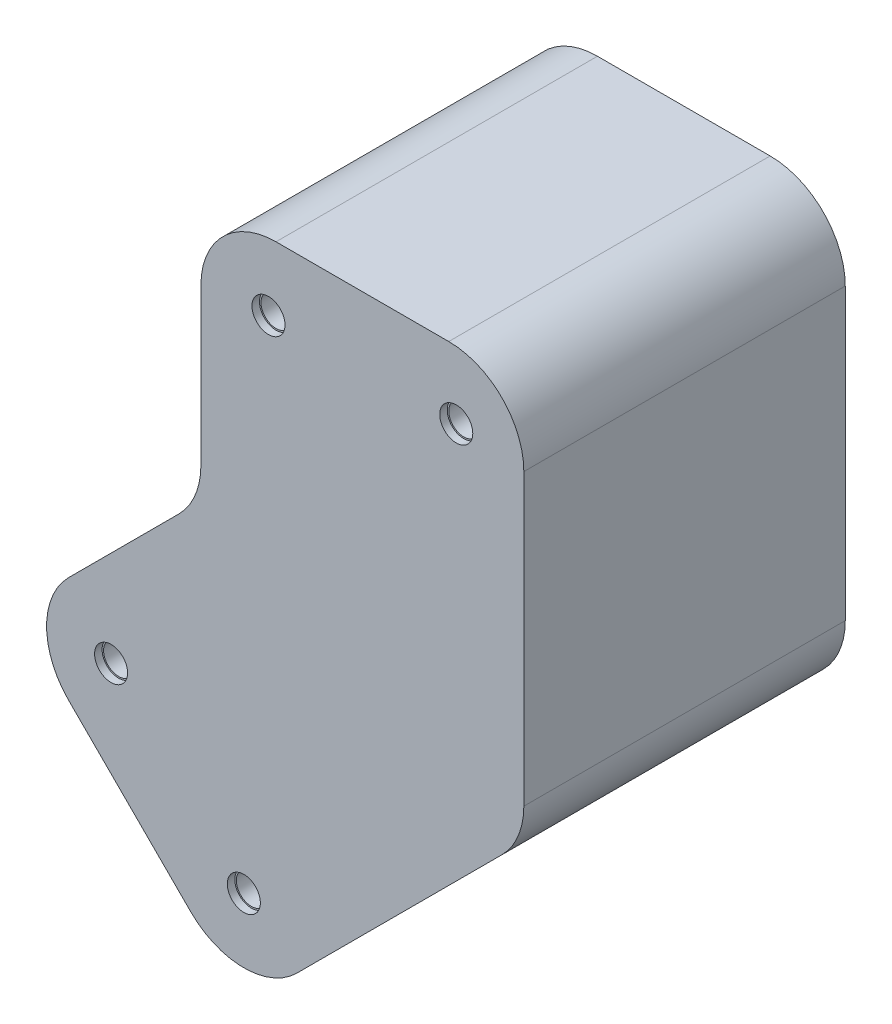
ISO-10303-21;
HEADER;
FILE_DESCRIPTION(('STEP AP214'),'2;1');
FILE_NAME('part.step','',(''),(''),'','','');
FILE_SCHEMA(('AUTOMOTIVE_DESIGN { 1 0 10303 214 1 1 1 1 }'));
ENDSEC;
DATA;
#1=APPLICATION_CONTEXT('core data for automotive mechanical design processes');
#2=APPLICATION_PROTOCOL_DEFINITION('international standard','automotive_design',2000,#1);
#3=PRODUCT_CONTEXT('',#1,'mechanical');
#4=PRODUCT('Part','Part','',(#3));
#5=PRODUCT_RELATED_PRODUCT_CATEGORY('part','',(#4));
#6=PRODUCT_DEFINITION_FORMATION('','',#4);
#7=PRODUCT_DEFINITION_CONTEXT('part definition',#1,'design');
#8=PRODUCT_DEFINITION('design','',#6,#7);
#9=PRODUCT_DEFINITION_SHAPE('','',#8);
#10=(LENGTH_UNIT() NAMED_UNIT(*) SI_UNIT(.MILLI.,.METRE.));
#11=(NAMED_UNIT(*) PLANE_ANGLE_UNIT() SI_UNIT($,.RADIAN.));
#12=(NAMED_UNIT(*) SI_UNIT($,.STERADIAN.) SOLID_ANGLE_UNIT());
#13=UNCERTAINTY_MEASURE_WITH_UNIT(LENGTH_MEASURE(1.E-05),#10,'distance_accuracy_value','');
#14=(GEOMETRIC_REPRESENTATION_CONTEXT(3) GLOBAL_UNCERTAINTY_ASSIGNED_CONTEXT((#13)) GLOBAL_UNIT_ASSIGNED_CONTEXT((#10,
#11,#12)) REPRESENTATION_CONTEXT('',''));
#15=CARTESIAN_POINT('',(0.,0.,0.));
#16=DIRECTION('',(0.,0.,1.));
#17=DIRECTION('',(1.,0.,0.));
#18=AXIS2_PLACEMENT_3D('',#15,#16,#17);
#19=CARTESIAN_POINT('',(95.4949493661166,117.817279836453,42.8));
#20=DIRECTION('',(0.,-1.,0.));
#21=DIRECTION('',(0.,0.,-1.));
#22=AXIS2_PLACEMENT_3D('',#19,#20,#21);
#23=PLANE('',#22);
#24=DIRECTION('',(-1.,0.,0.));
#25=VECTOR('',#24,1.);
#26=CARTESIAN_POINT('',(95.4949493661166,117.817279836453,42.8));
#27=LINE('',#26,#25);
#28=CARTESIAN_POINT('',(85.4949493661166,117.817279836453,42.8));
#29=VERTEX_POINT('',#28);
#30=CARTESIAN_POINT('',(62.4949493661166,117.817279836453,42.8));
#31=VERTEX_POINT('',#30);
#32=EDGE_CURVE('E253',#29,#31,#27,.T.);
#33=ORIENTED_EDGE('',*,*,#32,.F.);
#34=DIRECTION('',(0.,0.,-1.));
#35=VECTOR('',#34,1.);
#36=CARTESIAN_POINT('',(85.4949493661166,117.817279836453,42.8));
#37=LINE('',#36,#35);
#38=CARTESIAN_POINT('',(85.4949493661166,117.817279836453,0.));
#39=VERTEX_POINT('',#38);
#40=EDGE_CURVE('E320',#29,#39,#37,.T.);
#41=ORIENTED_EDGE('',*,*,#40,.T.);
#42=DIRECTION('',(-1.,0.,0.));
#43=VECTOR('',#42,1.);
#44=CARTESIAN_POINT('',(95.4949493661166,117.817279836453,0.));
#45=LINE('',#44,#43);
#46=CARTESIAN_POINT('',(62.4949493661166,117.817279836453,0.));
#47=VERTEX_POINT('',#46);
#48=EDGE_CURVE('E252',#39,#47,#45,.T.);
#49=ORIENTED_EDGE('',*,*,#48,.T.);
#50=DIRECTION('',(0.,0.,-1.));
#51=VECTOR('',#50,1.);
#52=CARTESIAN_POINT('',(62.4949493661166,117.817279836453,42.8));
#53=LINE('',#52,#51);
#54=EDGE_CURVE('E318',#47,#31,#53,.F.);
#55=ORIENTED_EDGE('',*,*,#54,.T.);
#56=EDGE_LOOP('',(#33,#41,#49,#55));
#57=FACE_BOUND('',#56,.T.);
#58=ADVANCED_FACE('F39',(#57),#23,.F.);
#59=CARTESIAN_POINT('',(52.4949493661166,117.817279836453,42.8));
#60=DIRECTION('',(1.,0.,0.));
#61=DIRECTION('',(0.,0.,-1.));
#62=AXIS2_PLACEMENT_3D('',#59,#60,#61);
#63=PLANE('',#62);
#64=DIRECTION('',(0.,-1.,0.));
#65=VECTOR('',#64,1.);
#66=CARTESIAN_POINT('',(52.4949493661166,117.817279836453,42.8));
#67=LINE('',#66,#65);
#68=CARTESIAN_POINT('',(52.4949493661166,107.817279836453,42.8));
#69=VERTEX_POINT('',#68);
#70=CARTESIAN_POINT('',(52.4949493661166,87.042676580869,42.8));
#71=VERTEX_POINT('',#70);
#72=EDGE_CURVE('E256',#69,#71,#67,.T.);
#73=ORIENTED_EDGE('',*,*,#72,.F.);
#74=DIRECTION('',(0.,0.,-1.));
#75=VECTOR('',#74,1.);
#76=CARTESIAN_POINT('',(52.4949493661166,107.817279836453,42.8));
#77=LINE('',#76,#75);
#78=CARTESIAN_POINT('',(52.4949493661166,107.817279836453,0.));
#79=VERTEX_POINT('',#78);
#80=EDGE_CURVE('E325',#69,#79,#77,.T.);
#81=ORIENTED_EDGE('',*,*,#80,.T.);
#82=DIRECTION('',(0.,-1.,0.));
#83=VECTOR('',#82,1.);
#84=CARTESIAN_POINT('',(52.4949493661166,117.817279836453,0.));
#85=LINE('',#84,#83);
#86=CARTESIAN_POINT('',(52.4949493661166,87.042676580869,0.));
#87=VERTEX_POINT('',#86);
#88=EDGE_CURVE('E273',#79,#87,#85,.T.);
#89=ORIENTED_EDGE('',*,*,#88,.T.);
#90=DIRECTION('',(0.,0.,-1.));
#91=VECTOR('',#90,1.);
#92=CARTESIAN_POINT('',(52.4949493661166,87.042676580869,42.8));
#93=LINE('',#92,#91);
#94=EDGE_CURVE('E323',#87,#71,#93,.F.);
#95=ORIENTED_EDGE('',*,*,#94,.T.);
#96=EDGE_LOOP('',(#73,#81,#89,#95));
#97=FACE_BOUND('',#96,.T.);
#98=ADVANCED_FACE('F342',(#97),#63,.F.);
#99=CARTESIAN_POINT('',(52.4949493661166,82.9005409571381,42.8));
#100=DIRECTION('',(0.707106781186547,-0.707106781186548,0.));
#101=DIRECTION('',(0.707106781186548,0.707106781186547,0.));
#102=AXIS2_PLACEMENT_3D('',#99,#100,#101);
#103=PLANE('',#102);
#104=DIRECTION('',(-0.707106781186548,-0.707106781186547,0.));
#105=VECTOR('',#104,1.);
#106=CARTESIAN_POINT('',(52.4949493661166,82.9005409571381,42.8));
#107=LINE('',#106,#105);
#108=CARTESIAN_POINT('',(49.5660171779821,79.9716087690036,42.8));
#109=VERTEX_POINT('',#108);
#110=CARTESIAN_POINT('',(34.8761543394987,65.2817459305201,42.8));
#111=VERTEX_POINT('',#110);
#112=EDGE_CURVE('E260',#109,#111,#107,.T.);
#113=ORIENTED_EDGE('',*,*,#112,.F.);
#114=DIRECTION('',(0.,0.,-1.));
#115=VECTOR('',#114,1.);
#116=CARTESIAN_POINT('',(49.5660171779821,79.9716087690036,0.));
#117=LINE('',#116,#115);
#118=CARTESIAN_POINT('',(49.5660171779821,79.9716087690036,0.));
#119=VERTEX_POINT('',#118);
#120=EDGE_CURVE('E330',#109,#119,#117,.T.);
#121=ORIENTED_EDGE('',*,*,#120,.T.);
#122=DIRECTION('',(-0.707106781186548,-0.707106781186547,0.));
#123=VECTOR('',#122,1.);
#124=CARTESIAN_POINT('',(52.4949493661166,82.9005409571381,0.));
#125=LINE('',#124,#123);
#126=CARTESIAN_POINT('',(34.8761543394987,65.2817459305201,0.));
#127=VERTEX_POINT('',#126);
#128=EDGE_CURVE('E276',#119,#127,#125,.T.);
#129=ORIENTED_EDGE('',*,*,#128,.T.);
#130=DIRECTION('',(0.,0.,-1.));
#131=VECTOR('',#130,1.);
#132=CARTESIAN_POINT('',(34.8761543394987,65.2817459305201,42.8));
#133=LINE('',#132,#131);
#134=EDGE_CURVE('E328',#127,#111,#133,.F.);
#135=ORIENTED_EDGE('',*,*,#134,.T.);
#136=EDGE_LOOP('',(#113,#121,#129,#135));
#137=FACE_BOUND('',#136,.T.);
#138=ADVANCED_FACE('F350',(#137),#103,.F.);
#139=CARTESIAN_POINT('',(27.8050865276332,58.2106781186546,42.8));
#140=DIRECTION('',(0.707106781186548,0.707106781186548,0.));
#141=DIRECTION('',(-0.707106781186548,0.707106781186548,0.));
#142=AXIS2_PLACEMENT_3D('',#139,#140,#141);
#143=PLANE('',#142);
#144=DIRECTION('',(0.707106781186548,-0.707106781186548,0.));
#145=VECTOR('',#144,1.);
#146=CARTESIAN_POINT('',(27.8050865276332,58.2106781186546,0.));
#147=LINE('',#146,#145);
#148=CARTESIAN_POINT('',(34.8761543394987,51.1396103067891,0.));
#149=VERTEX_POINT('',#148);
#150=CARTESIAN_POINT('',(51.1396103067892,34.8761543394986,0.));
#151=VERTEX_POINT('',#150);
#152=EDGE_CURVE('E279',#149,#151,#147,.T.);
#153=ORIENTED_EDGE('',*,*,#152,.T.);
#154=DIRECTION('',(0.,0.,-1.));
#155=VECTOR('',#154,1.);
#156=CARTESIAN_POINT('',(51.1396103067892,34.8761543394986,42.8));
#157=LINE('',#156,#155);
#158=CARTESIAN_POINT('',(51.1396103067892,34.8761543394986,42.8));
#159=VERTEX_POINT('',#158);
#160=EDGE_CURVE('E303',#151,#159,#157,.F.);
#161=ORIENTED_EDGE('',*,*,#160,.T.);
#162=DIRECTION('',(0.707106781186548,-0.707106781186548,0.));
#163=VECTOR('',#162,1.);
#164=CARTESIAN_POINT('',(27.8050865276332,58.2106781186546,42.8));
#165=LINE('',#164,#163);
#166=CARTESIAN_POINT('',(34.8761543394987,51.1396103067891,42.8));
#167=VERTEX_POINT('',#166);
#168=EDGE_CURVE('E263',#167,#159,#165,.T.);
#169=ORIENTED_EDGE('',*,*,#168,.F.);
#170=DIRECTION('',(0.,0.,-1.));
#171=VECTOR('',#170,1.);
#172=CARTESIAN_POINT('',(34.8761543394987,51.1396103067891,42.8));
#173=LINE('',#172,#171);
#174=EDGE_CURVE('E300',#167,#149,#173,.T.);
#175=ORIENTED_EDGE('',*,*,#174,.T.);
#176=EDGE_LOOP('',(#153,#161,#169,#175));
#177=FACE_BOUND('',#176,.T.);
#178=ADVANCED_FACE('F357',(#177),#143,.F.);
#179=CARTESIAN_POINT('',(58.2106781186547,27.8050865276331,42.8));
#180=DIRECTION('',(-0.707106781186548,0.707106781186547,0.));
#181=DIRECTION('',(-0.707106781186547,-0.707106781186548,0.));
#182=AXIS2_PLACEMENT_3D('',#179,#180,#181);
#183=PLANE('',#182);
#184=DIRECTION('',(0.707106781186547,0.707106781186548,0.));
#185=VECTOR('',#184,1.);
#186=CARTESIAN_POINT('',(58.2106781186547,27.8050865276331,42.8));
#187=LINE('',#186,#185);
#188=CARTESIAN_POINT('',(65.2817459305202,34.8761543394986,42.8));
#189=VERTEX_POINT('',#188);
#190=CARTESIAN_POINT('',(92.5660171779821,62.1604255869605,42.8));
#191=VERTEX_POINT('',#190);
#192=EDGE_CURVE('E266',#189,#191,#187,.T.);
#193=ORIENTED_EDGE('',*,*,#192,.F.);
#194=DIRECTION('',(0.,0.,-1.));
#195=VECTOR('',#194,1.);
#196=CARTESIAN_POINT('',(65.2817459305202,34.8761543394986,42.8));
#197=LINE('',#196,#195);
#198=CARTESIAN_POINT('',(65.2817459305202,34.8761543394986,0.));
#199=VERTEX_POINT('',#198);
#200=EDGE_CURVE('E287',#189,#199,#197,.T.);
#201=ORIENTED_EDGE('',*,*,#200,.T.);
#202=DIRECTION('',(0.707106781186547,0.707106781186548,0.));
#203=VECTOR('',#202,1.);
#204=CARTESIAN_POINT('',(58.2106781186547,27.8050865276331,0.));
#205=LINE('',#204,#203);
#206=CARTESIAN_POINT('',(92.5660171779821,62.1604255869605,0.));
#207=VERTEX_POINT('',#206);
#208=EDGE_CURVE('E282',#199,#207,#205,.T.);
#209=ORIENTED_EDGE('',*,*,#208,.T.);
#210=DIRECTION('',(0.,0.,-1.));
#211=VECTOR('',#210,1.);
#212=CARTESIAN_POINT('',(92.5660171779821,62.1604255869605,42.8));
#213=LINE('',#212,#211);
#214=EDGE_CURVE('E270',#207,#191,#213,.F.);
#215=ORIENTED_EDGE('',*,*,#214,.T.);
#216=EDGE_LOOP('',(#193,#201,#209,#215));
#217=FACE_BOUND('',#216,.T.);
#218=ADVANCED_FACE('F365',(#217),#183,.F.);
#219=CARTESIAN_POINT('',(95.4949493661166,65.089357775095,42.8));
#220=DIRECTION('',(-1.,0.,0.));
#221=DIRECTION('',(0.,0.,1.));
#222=AXIS2_PLACEMENT_3D('',#219,#220,#221);
#223=PLANE('',#222);
#224=DIRECTION('',(0.,1.,0.));
#225=VECTOR('',#224,1.);
#226=CARTESIAN_POINT('',(95.4949493661166,65.089357775095,42.8));
#227=LINE('',#226,#225);
#228=CARTESIAN_POINT('',(95.4949493661166,69.231493398826,42.8));
#229=VERTEX_POINT('',#228);
#230=CARTESIAN_POINT('',(95.4949493661166,107.817279836453,42.8));
#231=VERTEX_POINT('',#230);
#232=EDGE_CURVE('E268',#229,#231,#227,.T.);
#233=ORIENTED_EDGE('',*,*,#232,.F.);
#234=DIRECTION('',(0.,0.,-1.));
#235=VECTOR('',#234,1.);
#236=CARTESIAN_POINT('',(95.4949493661166,69.231493398826,42.8));
#237=LINE('',#236,#235);
#238=CARTESIAN_POINT('',(95.4949493661166,69.231493398826,0.));
#239=VERTEX_POINT('',#238);
#240=EDGE_CURVE('E315',#229,#239,#237,.T.);
#241=ORIENTED_EDGE('',*,*,#240,.T.);
#242=DIRECTION('',(0.,1.,0.));
#243=VECTOR('',#242,1.);
#244=CARTESIAN_POINT('',(95.4949493661166,65.089357775095,0.));
#245=LINE('',#244,#243);
#246=CARTESIAN_POINT('',(95.4949493661166,107.817279836453,0.));
#247=VERTEX_POINT('',#246);
#248=EDGE_CURVE('E257',#239,#247,#245,.T.);
#249=ORIENTED_EDGE('',*,*,#248,.T.);
#250=DIRECTION('',(0.,0.,-1.));
#251=VECTOR('',#250,1.);
#252=CARTESIAN_POINT('',(95.4949493661166,107.817279836453,42.8));
#253=LINE('',#252,#251);
#254=EDGE_CURVE('E54',#247,#231,#253,.F.);
#255=ORIENTED_EDGE('',*,*,#254,.T.);
#256=EDGE_LOOP('',(#233,#241,#249,#255));
#257=FACE_BOUND('',#256,.T.);
#258=ADVANCED_FACE('F371',(#257),#223,.F.);
#259=CARTESIAN_POINT('',(0.,0.,42.8));
#260=DIRECTION('',(0.,0.,1.));
#261=DIRECTION('',(1.,0.,0.));
#262=AXIS2_PLACEMENT_3D('',#259,#260,#261);
#263=PLANE('',#262);
#264=CARTESIAN_POINT('',(61.4949493661166,108.817279836453,42.8));
#265=DIRECTION('',(0.,0.,1.));
#266=DIRECTION('',(1.,0.,0.));
#267=AXIS2_PLACEMENT_3D('',#264,#265,#266);
#268=CIRCLE('',#267,2.2);
#269=CARTESIAN_POINT('',(63.6949493661166,108.817279836453,42.8));
#270=VERTEX_POINT('',#269);
#271=EDGE_CURVE('E779',#270,#270,#268,.T.);
#272=ORIENTED_EDGE('',*,*,#271,.F.);
#273=EDGE_LOOP('',(#272));
#274=FACE_BOUND('',#273,.T.);
#275=CARTESIAN_POINT('',(86.4949493661166,108.817279836453,42.8));
#276=DIRECTION('',(0.,0.,1.));
#277=DIRECTION('',(1.,0.,0.));
#278=AXIS2_PLACEMENT_3D('',#275,#276,#277);
#279=CIRCLE('',#278,2.19999999999999);
#280=CARTESIAN_POINT('',(88.6949493661166,108.817279836453,42.8));
#281=VERTEX_POINT('',#280);
#282=EDGE_CURVE('E161',#281,#281,#279,.T.);
#283=ORIENTED_EDGE('',*,*,#282,.F.);
#284=EDGE_LOOP('',(#283));
#285=FACE_BOUND('',#284,.T.);
#286=CARTESIAN_POINT('',(58.2106781186547,40.5330085889909,42.8));
#287=DIRECTION('',(0.,0.,1.));
#288=DIRECTION('',(1.,0.,0.));
#289=AXIS2_PLACEMENT_3D('',#286,#287,#288);
#290=CIRCLE('',#289,2.19999999999999);
#291=CARTESIAN_POINT('',(60.4106781186547,40.5330085889909,42.8));
#292=VERTEX_POINT('',#291);
#293=EDGE_CURVE('E180',#292,#292,#290,.T.);
#294=ORIENTED_EDGE('',*,*,#293,.F.);
#295=EDGE_LOOP('',(#294));
#296=FACE_BOUND('',#295,.T.);
#297=CARTESIAN_POINT('',(40.533008588991,58.2106781186546,42.8));
#298=DIRECTION('',(0.,0.,1.));
#299=DIRECTION('',(1.,0.,0.));
#300=AXIS2_PLACEMENT_3D('',#297,#298,#299);
#301=CIRCLE('',#300,2.19999999999999);
#302=CARTESIAN_POINT('',(42.733008588991,58.2106781186546,42.8));
#303=VERTEX_POINT('',#302);
#304=EDGE_CURVE('E192',#303,#303,#301,.T.);
#305=ORIENTED_EDGE('',*,*,#304,.F.);
#306=EDGE_LOOP('',(#305));
#307=FACE_BOUND('',#306,.T.);
#308=ORIENTED_EDGE('',*,*,#168,.T.);
#309=CARTESIAN_POINT('',(58.2106781186547,41.947222151364,42.8));
#310=DIRECTION('',(0.,0.,1.));
#311=DIRECTION('',(1.,0.,0.));
#312=AXIS2_PLACEMENT_3D('',#309,#310,#311);
#313=CIRCLE('',#312,10.);
#314=EDGE_CURVE('E312',#159,#189,#313,.T.);
#315=ORIENTED_EDGE('',*,*,#314,.T.);
#316=ORIENTED_EDGE('',*,*,#192,.T.);
#317=CARTESIAN_POINT('',(85.4949493661166,69.231493398826,42.8));
#318=DIRECTION('',(0.,0.,1.));
#319=DIRECTION('',(1.,0.,0.));
#320=AXIS2_PLACEMENT_3D('',#317,#318,#319);
#321=CIRCLE('',#320,10.);
#322=EDGE_CURVE('E61',#191,#229,#321,.T.);
#323=ORIENTED_EDGE('',*,*,#322,.T.);
#324=ORIENTED_EDGE('',*,*,#232,.T.);
#325=CARTESIAN_POINT('',(85.4949493661166,107.817279836453,42.8));
#326=DIRECTION('',(0.,0.,1.));
#327=DIRECTION('',(1.,0.,0.));
#328=AXIS2_PLACEMENT_3D('',#325,#326,#327);
#329=CIRCLE('',#328,10.);
#330=EDGE_CURVE('E309',#231,#29,#329,.T.);
#331=ORIENTED_EDGE('',*,*,#330,.T.);
#332=ORIENTED_EDGE('',*,*,#32,.T.);
#333=CARTESIAN_POINT('',(62.4949493661166,107.817279836453,42.8));
#334=DIRECTION('',(0.,0.,1.));
#335=DIRECTION('',(1.,0.,0.));
#336=AXIS2_PLACEMENT_3D('',#333,#334,#335);
#337=CIRCLE('',#336,10.);
#338=EDGE_CURVE('E307',#31,#69,#337,.T.);
#339=ORIENTED_EDGE('',*,*,#338,.T.);
#340=ORIENTED_EDGE('',*,*,#72,.T.);
#341=CARTESIAN_POINT('',(42.4949493661166,87.042676580869,42.8));
#342=DIRECTION('',(0.,0.,1.));
#343=DIRECTION('',(1.,0.,0.));
#344=AXIS2_PLACEMENT_3D('',#341,#342,#343);
#345=CIRCLE('',#344,10.);
#346=EDGE_CURVE('E11',#71,#109,#345,.F.);
#347=ORIENTED_EDGE('',*,*,#346,.T.);
#348=ORIENTED_EDGE('',*,*,#112,.T.);
#349=CARTESIAN_POINT('',(41.9472221513641,58.2106781186546,42.8));
#350=DIRECTION('',(0.,0.,1.));
#351=DIRECTION('',(1.,0.,0.));
#352=AXIS2_PLACEMENT_3D('',#349,#350,#351);
#353=CIRCLE('',#352,10.);
#354=EDGE_CURVE('E305',#111,#167,#353,.T.);
#355=ORIENTED_EDGE('',*,*,#354,.T.);
#356=EDGE_LOOP('',(#308,#315,#316,#323,#324,#331,#332,#339,#340,#347,#348,#355));
#357=FACE_BOUND('',#356,.T.);
#358=ADVANCED_FACE('F347',(#274,#285,#296,#307,#357),#263,.T.);
#359=CARTESIAN_POINT('',(0.,0.,0.));
#360=DIRECTION('',(0.,0.,1.));
#361=DIRECTION('',(1.,0.,0.));
#362=AXIS2_PLACEMENT_3D('',#359,#360,#361);
#363=PLANE('',#362);
#364=CARTESIAN_POINT('',(86.4949493661166,108.817279836453,0.));
#365=DIRECTION('',(0.,0.,-1.));
#366=DIRECTION('',(-1.,0.,0.));
#367=AXIS2_PLACEMENT_3D('',#364,#365,#366);
#368=CIRCLE('',#367,2.19999999999999);
#369=CARTESIAN_POINT('',(84.2949493661166,108.817279836453,0.));
#370=VERTEX_POINT('',#369);
#371=EDGE_CURVE('E204',#370,#370,#368,.T.);
#372=ORIENTED_EDGE('',*,*,#371,.F.);
#373=EDGE_LOOP('',(#372));
#374=FACE_BOUND('',#373,.T.);
#375=CARTESIAN_POINT('',(61.4949493661166,108.817279836453,0.));
#376=DIRECTION('',(0.,0.,-1.));
#377=DIRECTION('',(-1.,0.,0.));
#378=AXIS2_PLACEMENT_3D('',#375,#376,#377);
#379=CIRCLE('',#378,2.2);
#380=CARTESIAN_POINT('',(59.2949493661166,108.817279836453,0.));
#381=VERTEX_POINT('',#380);
#382=EDGE_CURVE('E216',#381,#381,#379,.T.);
#383=ORIENTED_EDGE('',*,*,#382,.F.);
#384=EDGE_LOOP('',(#383));
#385=FACE_BOUND('',#384,.T.);
#386=CARTESIAN_POINT('',(58.2106781186547,40.5330085889909,0.));
#387=DIRECTION('',(0.,0.,-1.));
#388=DIRECTION('',(-1.,0.,0.));
#389=AXIS2_PLACEMENT_3D('',#386,#387,#388);
#390=CIRCLE('',#389,2.2);
#391=CARTESIAN_POINT('',(56.0106781186547,40.5330085889909,0.));
#392=VERTEX_POINT('',#391);
#393=EDGE_CURVE('E228',#392,#392,#390,.T.);
#394=ORIENTED_EDGE('',*,*,#393,.F.);
#395=EDGE_LOOP('',(#394));
#396=FACE_BOUND('',#395,.T.);
#397=CARTESIAN_POINT('',(40.533008588991,58.2106781186546,0.));
#398=DIRECTION('',(0.,0.,-1.));
#399=DIRECTION('',(-1.,0.,0.));
#400=AXIS2_PLACEMENT_3D('',#397,#398,#399);
#401=CIRCLE('',#400,2.2);
#402=CARTESIAN_POINT('',(38.333008588991,58.2106781186546,0.));
#403=VERTEX_POINT('',#402);
#404=EDGE_CURVE('E240',#403,#403,#401,.T.);
#405=ORIENTED_EDGE('',*,*,#404,.F.);
#406=EDGE_LOOP('',(#405));
#407=FACE_BOUND('',#406,.T.);
#408=ORIENTED_EDGE('',*,*,#208,.F.);
#409=CARTESIAN_POINT('',(58.2106781186547,41.947222151364,0.));
#410=DIRECTION('',(0.,0.,1.));
#411=DIRECTION('',(1.,0.,0.));
#412=AXIS2_PLACEMENT_3D('',#409,#410,#411);
#413=CIRCLE('',#412,10.);
#414=EDGE_CURVE('E298',#199,#151,#413,.F.);
#415=ORIENTED_EDGE('',*,*,#414,.T.);
#416=ORIENTED_EDGE('',*,*,#152,.F.);
#417=CARTESIAN_POINT('',(41.9472221513641,58.2106781186546,0.));
#418=DIRECTION('',(0.,0.,1.));
#419=DIRECTION('',(1.,0.,0.));
#420=AXIS2_PLACEMENT_3D('',#417,#418,#419);
#421=CIRCLE('',#420,10.);
#422=EDGE_CURVE('E290',#149,#127,#421,.F.);
#423=ORIENTED_EDGE('',*,*,#422,.T.);
#424=ORIENTED_EDGE('',*,*,#128,.F.);
#425=CARTESIAN_POINT('',(42.4949493661166,87.042676580869,0.));
#426=DIRECTION('',(0.,0.,1.));
#427=DIRECTION('',(1.,0.,0.));
#428=AXIS2_PLACEMENT_3D('',#425,#426,#427);
#429=CIRCLE('',#428,10.);
#430=EDGE_CURVE('E47',#119,#87,#429,.T.);
#431=ORIENTED_EDGE('',*,*,#430,.T.);
#432=ORIENTED_EDGE('',*,*,#88,.F.);
#433=CARTESIAN_POINT('',(62.4949493661166,107.817279836453,0.));
#434=DIRECTION('',(0.,0.,1.));
#435=DIRECTION('',(1.,0.,0.));
#436=AXIS2_PLACEMENT_3D('',#433,#434,#435);
#437=CIRCLE('',#436,10.);
#438=EDGE_CURVE('E292',#79,#47,#437,.F.);
#439=ORIENTED_EDGE('',*,*,#438,.T.);
#440=ORIENTED_EDGE('',*,*,#48,.F.);
#441=CARTESIAN_POINT('',(85.4949493661166,107.817279836453,0.));
#442=DIRECTION('',(0.,0.,1.));
#443=DIRECTION('',(1.,0.,0.));
#444=AXIS2_PLACEMENT_3D('',#441,#442,#443);
#445=CIRCLE('',#444,10.);
#446=EDGE_CURVE('E294',#39,#247,#445,.F.);
#447=ORIENTED_EDGE('',*,*,#446,.T.);
#448=ORIENTED_EDGE('',*,*,#248,.F.);
#449=CARTESIAN_POINT('',(85.4949493661166,69.231493398826,0.));
#450=DIRECTION('',(0.,0.,1.));
#451=DIRECTION('',(1.,0.,0.));
#452=AXIS2_PLACEMENT_3D('',#449,#450,#451);
#453=CIRCLE('',#452,10.);
#454=EDGE_CURVE('E296',#239,#207,#453,.F.);
#455=ORIENTED_EDGE('',*,*,#454,.T.);
#456=EDGE_LOOP('',(#408,#415,#416,#423,#424,#431,#432,#439,#440,#447,#448,#455));
#457=FACE_BOUND('',#456,.T.);
#458=ADVANCED_FACE('F336',(#374,#385,#396,#407,#457),#363,.F.);
#459=CARTESIAN_POINT('',(40.533008588991,58.2106781186546,5.49999999999999));
#460=DIRECTION('',(0.,0.,-1.));
#461=DIRECTION('',(-1.,0.,0.));
#462=AXIS2_PLACEMENT_3D('',#459,#460,#461);
#463=CONICAL_SURFACE('',#462,1.99999999999999,1.02974425867665);
#464=CARTESIAN_POINT('',(40.533008588991,58.2106781186546,6.70172123805512));
#465=VERTEX_POINT('',#464);
#466=VERTEX_LOOP('',#465);
#467=FACE_BOUND('',#466,.T.);
#468=CARTESIAN_POINT('',(40.533008588991,58.2106781186546,5.49999999999999));
#469=DIRECTION('',(0.,0.,-1.));
#470=DIRECTION('',(-1.,0.,0.));
#471=AXIS2_PLACEMENT_3D('',#468,#469,#470);
#472=CIRCLE('',#471,1.99999999999999);
#473=CARTESIAN_POINT('',(38.533008588991,58.2106781186546,5.49999999999999));
#474=VERTEX_POINT('',#473);
#475=EDGE_CURVE('E249',#474,#474,#472,.T.);
#476=ORIENTED_EDGE('',*,*,#475,.T.);
#477=EDGE_LOOP('',(#476));
#478=FACE_BOUND('',#477,.T.);
#479=ADVANCED_FACE('F706',(#467,#478),#463,.F.);
#480=CARTESIAN_POINT('',(40.533008588991,58.2106781186546,0.));
#481=DIRECTION('',(0.,0.,-1.));
#482=DIRECTION('',(-1.,0.,0.));
#483=AXIS2_PLACEMENT_3D('',#480,#481,#482);
#484=CYLINDRICAL_SURFACE('',#483,2.);
#485=ORIENTED_EDGE('',*,*,#475,.F.);
#486=EDGE_LOOP('',(#485));
#487=FACE_BOUND('',#486,.T.);
#488=CARTESIAN_POINT('',(40.533008588991,58.2106781186546,1.));
#489=DIRECTION('',(0.,0.,-1.));
#490=DIRECTION('',(-1.,0.,0.));
#491=AXIS2_PLACEMENT_3D('',#488,#489,#490);
#492=CIRCLE('',#491,2.);
#493=CARTESIAN_POINT('',(38.533008588991,58.2106781186546,1.));
#494=VERTEX_POINT('',#493);
#495=EDGE_CURVE('E246',#494,#494,#492,.T.);
#496=ORIENTED_EDGE('',*,*,#495,.T.);
#497=EDGE_LOOP('',(#496));
#498=FACE_BOUND('',#497,.T.);
#499=ADVANCED_FACE('F697',(#487,#498),#484,.F.);
#500=CARTESIAN_POINT('',(42.533008588991,58.2106781186546,1.));
#501=DIRECTION('',(0.,0.,1.));
#502=DIRECTION('',(1.,0.,0.));
#503=AXIS2_PLACEMENT_3D('',#500,#501,#502);
#504=PLANE('',#503);
#505=ORIENTED_EDGE('',*,*,#495,.F.);
#506=EDGE_LOOP('',(#505));
#507=FACE_BOUND('',#506,.T.);
#508=CARTESIAN_POINT('',(40.533008588991,58.2106781186546,1.));
#509=DIRECTION('',(0.,0.,-1.));
#510=DIRECTION('',(-1.,0.,0.));
#511=AXIS2_PLACEMENT_3D('',#508,#509,#510);
#512=CIRCLE('',#511,2.2);
#513=CARTESIAN_POINT('',(38.333008588991,58.2106781186546,1.));
#514=VERTEX_POINT('',#513);
#515=EDGE_CURVE('E243',#514,#514,#512,.T.);
#516=ORIENTED_EDGE('',*,*,#515,.T.);
#517=EDGE_LOOP('',(#516));
#518=FACE_BOUND('',#517,.T.);
#519=ADVANCED_FACE('F688',(#507,#518),#504,.F.);
#520=CARTESIAN_POINT('',(40.533008588991,58.2106781186546,0.));
#521=DIRECTION('',(0.,0.,-1.));
#522=DIRECTION('',(-1.,0.,0.));
#523=AXIS2_PLACEMENT_3D('',#520,#521,#522);
#524=CYLINDRICAL_SURFACE('',#523,2.2);
#525=ORIENTED_EDGE('',*,*,#515,.F.);
#526=EDGE_LOOP('',(#525));
#527=FACE_BOUND('',#526,.T.);
#528=ORIENTED_EDGE('',*,*,#404,.T.);
#529=EDGE_LOOP('',(#528));
#530=FACE_BOUND('',#529,.T.);
#531=ADVANCED_FACE('F679',(#527,#530),#524,.F.);
#532=CARTESIAN_POINT('',(58.2106781186547,40.5330085889909,5.49999999999999));
#533=DIRECTION('',(0.,0.,-1.));
#534=DIRECTION('',(-1.,0.,0.));
#535=AXIS2_PLACEMENT_3D('',#532,#533,#534);
#536=CONICAL_SURFACE('',#535,1.99999999999999,1.02974425867665);
#537=CARTESIAN_POINT('',(58.2106781186547,40.5330085889909,6.70172123805512));
#538=VERTEX_POINT('',#537);
#539=VERTEX_LOOP('',#538);
#540=FACE_BOUND('',#539,.T.);
#541=CARTESIAN_POINT('',(58.2106781186547,40.5330085889909,5.49999999999999));
#542=DIRECTION('',(0.,0.,-1.));
#543=DIRECTION('',(-1.,0.,0.));
#544=AXIS2_PLACEMENT_3D('',#541,#542,#543);
#545=CIRCLE('',#544,1.99999999999999);
#546=CARTESIAN_POINT('',(56.2106781186547,40.5330085889909,5.49999999999999));
#547=VERTEX_POINT('',#546);
#548=EDGE_CURVE('E237',#547,#547,#545,.T.);
#549=ORIENTED_EDGE('',*,*,#548,.T.);
#550=EDGE_LOOP('',(#549));
#551=FACE_BOUND('',#550,.T.);
#552=ADVANCED_FACE('F670',(#540,#551),#536,.F.);
#553=CARTESIAN_POINT('',(58.2106781186547,40.5330085889909,0.));
#554=DIRECTION('',(0.,0.,-1.));
#555=DIRECTION('',(-1.,0.,0.));
#556=AXIS2_PLACEMENT_3D('',#553,#554,#555);
#557=CYLINDRICAL_SURFACE('',#556,2.);
#558=ORIENTED_EDGE('',*,*,#548,.F.);
#559=EDGE_LOOP('',(#558));
#560=FACE_BOUND('',#559,.T.);
#561=CARTESIAN_POINT('',(58.2106781186547,40.5330085889909,1.));
#562=DIRECTION('',(0.,0.,-1.));
#563=DIRECTION('',(-1.,0.,0.));
#564=AXIS2_PLACEMENT_3D('',#561,#562,#563);
#565=CIRCLE('',#564,2.);
#566=CARTESIAN_POINT('',(56.2106781186547,40.5330085889909,1.));
#567=VERTEX_POINT('',#566);
#568=EDGE_CURVE('E234',#567,#567,#565,.T.);
#569=ORIENTED_EDGE('',*,*,#568,.T.);
#570=EDGE_LOOP('',(#569));
#571=FACE_BOUND('',#570,.T.);
#572=ADVANCED_FACE('F661',(#560,#571),#557,.F.);
#573=CARTESIAN_POINT('',(60.2106781186547,40.5330085889909,1.));
#574=DIRECTION('',(0.,0.,1.));
#575=DIRECTION('',(1.,0.,0.));
#576=AXIS2_PLACEMENT_3D('',#573,#574,#575);
#577=PLANE('',#576);
#578=ORIENTED_EDGE('',*,*,#568,.F.);
#579=EDGE_LOOP('',(#578));
#580=FACE_BOUND('',#579,.T.);
#581=CARTESIAN_POINT('',(58.2106781186547,40.5330085889909,1.));
#582=DIRECTION('',(0.,0.,-1.));
#583=DIRECTION('',(-1.,0.,0.));
#584=AXIS2_PLACEMENT_3D('',#581,#582,#583);
#585=CIRCLE('',#584,2.2);
#586=CARTESIAN_POINT('',(56.0106781186547,40.5330085889909,1.));
#587=VERTEX_POINT('',#586);
#588=EDGE_CURVE('E231',#587,#587,#585,.T.);
#589=ORIENTED_EDGE('',*,*,#588,.T.);
#590=EDGE_LOOP('',(#589));
#591=FACE_BOUND('',#590,.T.);
#592=ADVANCED_FACE('F652',(#580,#591),#577,.F.);
#593=CARTESIAN_POINT('',(58.2106781186547,40.5330085889909,0.));
#594=DIRECTION('',(0.,0.,-1.));
#595=DIRECTION('',(-1.,0.,0.));
#596=AXIS2_PLACEMENT_3D('',#593,#594,#595);
#597=CYLINDRICAL_SURFACE('',#596,2.2);
#598=ORIENTED_EDGE('',*,*,#588,.F.);
#599=EDGE_LOOP('',(#598));
#600=FACE_BOUND('',#599,.T.);
#601=ORIENTED_EDGE('',*,*,#393,.T.);
#602=EDGE_LOOP('',(#601));
#603=FACE_BOUND('',#602,.T.);
#604=ADVANCED_FACE('F643',(#600,#603),#597,.F.);
#605=CARTESIAN_POINT('',(61.4949493661166,108.817279836453,5.49999999999999));
#606=DIRECTION('',(0.,0.,-1.));
#607=DIRECTION('',(-1.,0.,0.));
#608=AXIS2_PLACEMENT_3D('',#605,#606,#607);
#609=CONICAL_SURFACE('',#608,1.99999999999999,1.02974425867665);
#610=CARTESIAN_POINT('',(61.4949493661166,108.817279836453,6.70172123805512));
#611=VERTEX_POINT('',#610);
#612=VERTEX_LOOP('',#611);
#613=FACE_BOUND('',#612,.T.);
#614=CARTESIAN_POINT('',(61.4949493661166,108.817279836453,5.49999999999999));
#615=DIRECTION('',(0.,0.,-1.));
#616=DIRECTION('',(-1.,0.,0.));
#617=AXIS2_PLACEMENT_3D('',#614,#615,#616);
#618=CIRCLE('',#617,1.99999999999999);
#619=CARTESIAN_POINT('',(59.4949493661166,108.817279836453,5.49999999999999));
#620=VERTEX_POINT('',#619);
#621=EDGE_CURVE('E225',#620,#620,#618,.T.);
#622=ORIENTED_EDGE('',*,*,#621,.T.);
#623=EDGE_LOOP('',(#622));
#624=FACE_BOUND('',#623,.T.);
#625=ADVANCED_FACE('F634',(#613,#624),#609,.F.);
#626=CARTESIAN_POINT('',(61.4949493661166,108.817279836453,0.));
#627=DIRECTION('',(0.,0.,-1.));
#628=DIRECTION('',(-1.,0.,0.));
#629=AXIS2_PLACEMENT_3D('',#626,#627,#628);
#630=CYLINDRICAL_SURFACE('',#629,1.99999999999999);
#631=ORIENTED_EDGE('',*,*,#621,.F.);
#632=EDGE_LOOP('',(#631));
#633=FACE_BOUND('',#632,.T.);
#634=CARTESIAN_POINT('',(61.4949493661166,108.817279836453,1.));
#635=DIRECTION('',(0.,0.,-1.));
#636=DIRECTION('',(-1.,0.,0.));
#637=AXIS2_PLACEMENT_3D('',#634,#635,#636);
#638=CIRCLE('',#637,1.99999999999999);
#639=CARTESIAN_POINT('',(59.4949493661166,108.817279836453,1.));
#640=VERTEX_POINT('',#639);
#641=EDGE_CURVE('E222',#640,#640,#638,.T.);
#642=ORIENTED_EDGE('',*,*,#641,.T.);
#643=EDGE_LOOP('',(#642));
#644=FACE_BOUND('',#643,.T.);
#645=ADVANCED_FACE('F625',(#633,#644),#630,.F.);
#646=CARTESIAN_POINT('',(63.4949493661166,108.817279836453,1.));
#647=DIRECTION('',(0.,0.,1.));
#648=DIRECTION('',(1.,0.,0.));
#649=AXIS2_PLACEMENT_3D('',#646,#647,#648);
#650=PLANE('',#649);
#651=ORIENTED_EDGE('',*,*,#641,.F.);
#652=EDGE_LOOP('',(#651));
#653=FACE_BOUND('',#652,.T.);
#654=CARTESIAN_POINT('',(61.4949493661166,108.817279836453,1.));
#655=DIRECTION('',(0.,0.,-1.));
#656=DIRECTION('',(-1.,0.,0.));
#657=AXIS2_PLACEMENT_3D('',#654,#655,#656);
#658=CIRCLE('',#657,2.2);
#659=CARTESIAN_POINT('',(59.2949493661166,108.817279836453,1.));
#660=VERTEX_POINT('',#659);
#661=EDGE_CURVE('E219',#660,#660,#658,.T.);
#662=ORIENTED_EDGE('',*,*,#661,.T.);
#663=EDGE_LOOP('',(#662));
#664=FACE_BOUND('',#663,.T.);
#665=ADVANCED_FACE('F616',(#653,#664),#650,.F.);
#666=CARTESIAN_POINT('',(61.4949493661166,108.817279836453,0.));
#667=DIRECTION('',(0.,0.,-1.));
#668=DIRECTION('',(-1.,0.,0.));
#669=AXIS2_PLACEMENT_3D('',#666,#667,#668);
#670=CYLINDRICAL_SURFACE('',#669,2.2);
#671=ORIENTED_EDGE('',*,*,#661,.F.);
#672=EDGE_LOOP('',(#671));
#673=FACE_BOUND('',#672,.T.);
#674=ORIENTED_EDGE('',*,*,#382,.T.);
#675=EDGE_LOOP('',(#674));
#676=FACE_BOUND('',#675,.T.);
#677=ADVANCED_FACE('F607',(#673,#676),#670,.F.);
#678=CARTESIAN_POINT('',(86.4949493661166,108.817279836453,5.49999999999999));
#679=DIRECTION('',(0.,0.,-1.));
#680=DIRECTION('',(-1.,0.,0.));
#681=AXIS2_PLACEMENT_3D('',#678,#679,#680);
#682=CONICAL_SURFACE('',#681,2.,1.02974425867665);
#683=CARTESIAN_POINT('',(86.4949493661166,108.817279836453,6.70172123805512));
#684=VERTEX_POINT('',#683);
#685=VERTEX_LOOP('',#684);
#686=FACE_BOUND('',#685,.T.);
#687=CARTESIAN_POINT('',(86.4949493661166,108.817279836453,5.49999999999999));
#688=DIRECTION('',(0.,0.,-1.));
#689=DIRECTION('',(-1.,0.,0.));
#690=AXIS2_PLACEMENT_3D('',#687,#688,#689);
#691=CIRCLE('',#690,2.);
#692=CARTESIAN_POINT('',(84.4949493661166,108.817279836453,5.49999999999999));
#693=VERTEX_POINT('',#692);
#694=EDGE_CURVE('E213',#693,#693,#691,.T.);
#695=ORIENTED_EDGE('',*,*,#694,.T.);
#696=EDGE_LOOP('',(#695));
#697=FACE_BOUND('',#696,.T.);
#698=ADVANCED_FACE('F598',(#686,#697),#682,.F.);
#699=CARTESIAN_POINT('',(86.4949493661166,108.817279836453,0.));
#700=DIRECTION('',(0.,0.,-1.));
#701=DIRECTION('',(-1.,0.,0.));
#702=AXIS2_PLACEMENT_3D('',#699,#700,#701);
#703=CYLINDRICAL_SURFACE('',#702,2.);
#704=ORIENTED_EDGE('',*,*,#694,.F.);
#705=EDGE_LOOP('',(#704));
#706=FACE_BOUND('',#705,.T.);
#707=CARTESIAN_POINT('',(86.4949493661166,108.817279836453,1.));
#708=DIRECTION('',(0.,0.,-1.));
#709=DIRECTION('',(-1.,0.,0.));
#710=AXIS2_PLACEMENT_3D('',#707,#708,#709);
#711=CIRCLE('',#710,2.);
#712=CARTESIAN_POINT('',(84.4949493661166,108.817279836453,1.));
#713=VERTEX_POINT('',#712);
#714=EDGE_CURVE('E210',#713,#713,#711,.T.);
#715=ORIENTED_EDGE('',*,*,#714,.T.);
#716=EDGE_LOOP('',(#715));
#717=FACE_BOUND('',#716,.T.);
#718=ADVANCED_FACE('F589',(#706,#717),#703,.F.);
#719=CARTESIAN_POINT('',(88.4949493661166,108.817279836453,1.));
#720=DIRECTION('',(0.,0.,1.));
#721=DIRECTION('',(1.,0.,0.));
#722=AXIS2_PLACEMENT_3D('',#719,#720,#721);
#723=PLANE('',#722);
#724=ORIENTED_EDGE('',*,*,#714,.F.);
#725=EDGE_LOOP('',(#724));
#726=FACE_BOUND('',#725,.T.);
#727=CARTESIAN_POINT('',(86.4949493661166,108.817279836453,1.));
#728=DIRECTION('',(0.,0.,-1.));
#729=DIRECTION('',(-1.,0.,0.));
#730=AXIS2_PLACEMENT_3D('',#727,#728,#729);
#731=CIRCLE('',#730,2.19999999999999);
#732=CARTESIAN_POINT('',(84.2949493661166,108.817279836453,1.));
#733=VERTEX_POINT('',#732);
#734=EDGE_CURVE('E207',#733,#733,#731,.T.);
#735=ORIENTED_EDGE('',*,*,#734,.T.);
#736=EDGE_LOOP('',(#735));
#737=FACE_BOUND('',#736,.T.);
#738=ADVANCED_FACE('F580',(#726,#737),#723,.F.);
#739=CARTESIAN_POINT('',(86.4949493661166,108.817279836453,0.));
#740=DIRECTION('',(0.,0.,-1.));
#741=DIRECTION('',(-1.,0.,0.));
#742=AXIS2_PLACEMENT_3D('',#739,#740,#741);
#743=CYLINDRICAL_SURFACE('',#742,2.19999999999999);
#744=ORIENTED_EDGE('',*,*,#734,.F.);
#745=EDGE_LOOP('',(#744));
#746=FACE_BOUND('',#745,.T.);
#747=ORIENTED_EDGE('',*,*,#371,.T.);
#748=EDGE_LOOP('',(#747));
#749=FACE_BOUND('',#748,.T.);
#750=ADVANCED_FACE('F571',(#746,#749),#743,.F.);
#751=CARTESIAN_POINT('',(40.533008588991,58.2106781186546,37.3));
#752=DIRECTION('',(0.,0.,1.));
#753=DIRECTION('',(1.,0.,0.));
#754=AXIS2_PLACEMENT_3D('',#751,#752,#753);
#755=CONICAL_SURFACE('',#754,1.99999999999999,1.02974425867665);
#756=CARTESIAN_POINT('',(40.533008588991,58.2106781186546,36.0982787619449));
#757=VERTEX_POINT('',#756);
#758=VERTEX_LOOP('',#757);
#759=FACE_BOUND('',#758,.T.);
#760=CARTESIAN_POINT('',(40.533008588991,58.2106781186546,37.3));
#761=DIRECTION('',(0.,0.,1.));
#762=DIRECTION('',(1.,0.,0.));
#763=AXIS2_PLACEMENT_3D('',#760,#761,#762);
#764=CIRCLE('',#763,1.99999999999999);
#765=CARTESIAN_POINT('',(42.533008588991,58.2106781186546,37.3));
#766=VERTEX_POINT('',#765);
#767=EDGE_CURVE('E201',#766,#766,#764,.T.);
#768=ORIENTED_EDGE('',*,*,#767,.T.);
#769=EDGE_LOOP('',(#768));
#770=FACE_BOUND('',#769,.T.);
#771=ADVANCED_FACE('F562',(#759,#770),#755,.F.);
#772=CARTESIAN_POINT('',(40.533008588991,58.2106781186546,42.8));
#773=DIRECTION('',(0.,0.,1.));
#774=DIRECTION('',(1.,0.,0.));
#775=AXIS2_PLACEMENT_3D('',#772,#773,#774);
#776=CYLINDRICAL_SURFACE('',#775,1.99999999999999);
#777=ORIENTED_EDGE('',*,*,#767,.F.);
#778=EDGE_LOOP('',(#777));
#779=FACE_BOUND('',#778,.T.);
#780=CARTESIAN_POINT('',(40.533008588991,58.2106781186546,41.8));
#781=DIRECTION('',(0.,0.,1.));
#782=DIRECTION('',(1.,0.,0.));
#783=AXIS2_PLACEMENT_3D('',#780,#781,#782);
#784=CIRCLE('',#783,1.99999999999999);
#785=CARTESIAN_POINT('',(42.533008588991,58.2106781186546,41.8));
#786=VERTEX_POINT('',#785);
#787=EDGE_CURVE('E198',#786,#786,#784,.T.);
#788=ORIENTED_EDGE('',*,*,#787,.T.);
#789=EDGE_LOOP('',(#788));
#790=FACE_BOUND('',#789,.T.);
#791=ADVANCED_FACE('F553',(#779,#790),#776,.F.);
#792=CARTESIAN_POINT('',(42.533008588991,58.2106781186546,41.8));
#793=DIRECTION('',(0.,0.,-1.));
#794=DIRECTION('',(-1.,0.,0.));
#795=AXIS2_PLACEMENT_3D('',#792,#793,#794);
#796=PLANE('',#795);
#797=ORIENTED_EDGE('',*,*,#787,.F.);
#798=EDGE_LOOP('',(#797));
#799=FACE_BOUND('',#798,.T.);
#800=CARTESIAN_POINT('',(40.533008588991,58.2106781186546,41.8));
#801=DIRECTION('',(0.,0.,1.));
#802=DIRECTION('',(1.,0.,0.));
#803=AXIS2_PLACEMENT_3D('',#800,#801,#802);
#804=CIRCLE('',#803,2.19999999999999);
#805=CARTESIAN_POINT('',(42.733008588991,58.2106781186546,41.8));
#806=VERTEX_POINT('',#805);
#807=EDGE_CURVE('E195',#806,#806,#804,.T.);
#808=ORIENTED_EDGE('',*,*,#807,.T.);
#809=EDGE_LOOP('',(#808));
#810=FACE_BOUND('',#809,.T.);
#811=ADVANCED_FACE('F544',(#799,#810),#796,.F.);
#812=CARTESIAN_POINT('',(40.533008588991,58.2106781186546,42.8));
#813=DIRECTION('',(0.,0.,1.));
#814=DIRECTION('',(1.,0.,0.));
#815=AXIS2_PLACEMENT_3D('',#812,#813,#814);
#816=CYLINDRICAL_SURFACE('',#815,2.19999999999999);
#817=ORIENTED_EDGE('',*,*,#807,.F.);
#818=EDGE_LOOP('',(#817));
#819=FACE_BOUND('',#818,.T.);
#820=ORIENTED_EDGE('',*,*,#304,.T.);
#821=EDGE_LOOP('',(#820));
#822=FACE_BOUND('',#821,.T.);
#823=ADVANCED_FACE('F535',(#819,#822),#816,.F.);
#824=CARTESIAN_POINT('',(58.2106781186547,40.5330085889909,37.3));
#825=DIRECTION('',(0.,0.,1.));
#826=DIRECTION('',(1.,0.,0.));
#827=AXIS2_PLACEMENT_3D('',#824,#825,#826);
#828=CONICAL_SURFACE('',#827,1.99999999999999,1.02974425867665);
#829=CARTESIAN_POINT('',(58.2106781186547,40.5330085889909,36.0982787619449));
#830=VERTEX_POINT('',#829);
#831=VERTEX_LOOP('',#830);
#832=FACE_BOUND('',#831,.T.);
#833=CARTESIAN_POINT('',(58.2106781186547,40.5330085889909,37.3));
#834=DIRECTION('',(0.,0.,1.));
#835=DIRECTION('',(1.,0.,0.));
#836=AXIS2_PLACEMENT_3D('',#833,#834,#835);
#837=CIRCLE('',#836,1.99999999999999);
#838=CARTESIAN_POINT('',(60.2106781186547,40.5330085889909,37.3));
#839=VERTEX_POINT('',#838);
#840=EDGE_CURVE('E189',#839,#839,#837,.T.);
#841=ORIENTED_EDGE('',*,*,#840,.T.);
#842=EDGE_LOOP('',(#841));
#843=FACE_BOUND('',#842,.T.);
#844=ADVANCED_FACE('F526',(#832,#843),#828,.F.);
#845=CARTESIAN_POINT('',(58.2106781186547,40.5330085889909,42.8));
#846=DIRECTION('',(0.,0.,1.));
#847=DIRECTION('',(1.,0.,0.));
#848=AXIS2_PLACEMENT_3D('',#845,#846,#847);
#849=CYLINDRICAL_SURFACE('',#848,1.99999999999999);
#850=ORIENTED_EDGE('',*,*,#840,.F.);
#851=EDGE_LOOP('',(#850));
#852=FACE_BOUND('',#851,.T.);
#853=CARTESIAN_POINT('',(58.2106781186547,40.5330085889909,41.8));
#854=DIRECTION('',(0.,0.,1.));
#855=DIRECTION('',(1.,0.,0.));
#856=AXIS2_PLACEMENT_3D('',#853,#854,#855);
#857=CIRCLE('',#856,1.99999999999999);
#858=CARTESIAN_POINT('',(60.2106781186547,40.5330085889909,41.8));
#859=VERTEX_POINT('',#858);
#860=EDGE_CURVE('E186',#859,#859,#857,.T.);
#861=ORIENTED_EDGE('',*,*,#860,.T.);
#862=EDGE_LOOP('',(#861));
#863=FACE_BOUND('',#862,.T.);
#864=ADVANCED_FACE('F517',(#852,#863),#849,.F.);
#865=CARTESIAN_POINT('',(60.2106781186547,40.5330085889909,41.8));
#866=DIRECTION('',(0.,0.,-1.));
#867=DIRECTION('',(-1.,0.,0.));
#868=AXIS2_PLACEMENT_3D('',#865,#866,#867);
#869=PLANE('',#868);
#870=ORIENTED_EDGE('',*,*,#860,.F.);
#871=EDGE_LOOP('',(#870));
#872=FACE_BOUND('',#871,.T.);
#873=CARTESIAN_POINT('',(58.2106781186547,40.5330085889909,41.8));
#874=DIRECTION('',(0.,0.,1.));
#875=DIRECTION('',(1.,0.,0.));
#876=AXIS2_PLACEMENT_3D('',#873,#874,#875);
#877=CIRCLE('',#876,2.19999999999999);
#878=CARTESIAN_POINT('',(60.4106781186547,40.5330085889909,41.8));
#879=VERTEX_POINT('',#878);
#880=EDGE_CURVE('E183',#879,#879,#877,.T.);
#881=ORIENTED_EDGE('',*,*,#880,.T.);
#882=EDGE_LOOP('',(#881));
#883=FACE_BOUND('',#882,.T.);
#884=ADVANCED_FACE('F508',(#872,#883),#869,.F.);
#885=CARTESIAN_POINT('',(58.2106781186547,40.5330085889909,42.8));
#886=DIRECTION('',(0.,0.,1.));
#887=DIRECTION('',(1.,0.,0.));
#888=AXIS2_PLACEMENT_3D('',#885,#886,#887);
#889=CYLINDRICAL_SURFACE('',#888,2.19999999999999);
#890=ORIENTED_EDGE('',*,*,#880,.F.);
#891=EDGE_LOOP('',(#890));
#892=FACE_BOUND('',#891,.T.);
#893=ORIENTED_EDGE('',*,*,#293,.T.);
#894=EDGE_LOOP('',(#893));
#895=FACE_BOUND('',#894,.T.);
#896=ADVANCED_FACE('F499',(#892,#895),#889,.F.);
#897=CARTESIAN_POINT('',(86.4949493661166,108.817279836453,37.3));
#898=DIRECTION('',(0.,0.,1.));
#899=DIRECTION('',(1.,0.,0.));
#900=AXIS2_PLACEMENT_3D('',#897,#898,#899);
#901=CONICAL_SURFACE('',#900,2.,1.02974425867665);
#902=CARTESIAN_POINT('',(86.4949493661166,108.817279836453,36.0982787619449));
#903=VERTEX_POINT('',#902);
#904=VERTEX_LOOP('',#903);
#905=FACE_BOUND('',#904,.T.);
#906=CARTESIAN_POINT('',(86.4949493661166,108.817279836453,37.3));
#907=DIRECTION('',(0.,0.,1.));
#908=DIRECTION('',(1.,0.,0.));
#909=AXIS2_PLACEMENT_3D('',#906,#907,#908);
#910=CIRCLE('',#909,2.);
#911=CARTESIAN_POINT('',(88.4949493661166,108.817279836453,37.3));
#912=VERTEX_POINT('',#911);
#913=EDGE_CURVE('E177',#912,#912,#910,.T.);
#914=ORIENTED_EDGE('',*,*,#913,.T.);
#915=EDGE_LOOP('',(#914));
#916=FACE_BOUND('',#915,.T.);
#917=ADVANCED_FACE('F490',(#905,#916),#901,.F.);
#918=CARTESIAN_POINT('',(86.4949493661166,108.817279836453,42.8));
#919=DIRECTION('',(0.,0.,1.));
#920=DIRECTION('',(1.,0.,0.));
#921=AXIS2_PLACEMENT_3D('',#918,#919,#920);
#922=CYLINDRICAL_SURFACE('',#921,2.);
#923=ORIENTED_EDGE('',*,*,#913,.F.);
#924=EDGE_LOOP('',(#923));
#925=FACE_BOUND('',#924,.T.);
#926=CARTESIAN_POINT('',(86.4949493661166,108.817279836453,41.8));
#927=DIRECTION('',(0.,0.,1.));
#928=DIRECTION('',(1.,0.,0.));
#929=AXIS2_PLACEMENT_3D('',#926,#927,#928);
#930=CIRCLE('',#929,2.);
#931=CARTESIAN_POINT('',(88.4949493661166,108.817279836453,41.8));
#932=VERTEX_POINT('',#931);
#933=EDGE_CURVE('E174',#932,#932,#930,.T.);
#934=ORIENTED_EDGE('',*,*,#933,.T.);
#935=EDGE_LOOP('',(#934));
#936=FACE_BOUND('',#935,.T.);
#937=ADVANCED_FACE('F481',(#925,#936),#922,.F.);
#938=CARTESIAN_POINT('',(88.4949493661166,108.817279836453,41.8));
#939=DIRECTION('',(0.,0.,-1.));
#940=DIRECTION('',(-1.,0.,0.));
#941=AXIS2_PLACEMENT_3D('',#938,#939,#940);
#942=PLANE('',#941);
#943=ORIENTED_EDGE('',*,*,#933,.F.);
#944=EDGE_LOOP('',(#943));
#945=FACE_BOUND('',#944,.T.);
#946=CARTESIAN_POINT('',(86.4949493661166,108.817279836453,41.8));
#947=DIRECTION('',(0.,0.,1.));
#948=DIRECTION('',(1.,0.,0.));
#949=AXIS2_PLACEMENT_3D('',#946,#947,#948);
#950=CIRCLE('',#949,2.19999999999999);
#951=CARTESIAN_POINT('',(88.6949493661166,108.817279836453,41.8));
#952=VERTEX_POINT('',#951);
#953=EDGE_CURVE('E165',#952,#952,#950,.T.);
#954=ORIENTED_EDGE('',*,*,#953,.T.);
#955=EDGE_LOOP('',(#954));
#956=FACE_BOUND('',#955,.T.);
#957=ADVANCED_FACE('F472',(#945,#956),#942,.F.);
#958=CARTESIAN_POINT('',(86.4949493661166,108.817279836453,42.8));
#959=DIRECTION('',(0.,0.,1.));
#960=DIRECTION('',(1.,0.,0.));
#961=AXIS2_PLACEMENT_3D('',#958,#959,#960);
#962=CYLINDRICAL_SURFACE('',#961,2.19999999999999);
#963=ORIENTED_EDGE('',*,*,#953,.F.);
#964=EDGE_LOOP('',(#963));
#965=FACE_BOUND('',#964,.T.);
#966=ORIENTED_EDGE('',*,*,#282,.T.);
#967=EDGE_LOOP('',(#966));
#968=FACE_BOUND('',#967,.T.);
#969=ADVANCED_FACE('F155',(#965,#968),#962,.F.);
#970=CARTESIAN_POINT('',(61.4949493661166,108.817279836453,37.3));
#971=DIRECTION('',(0.,0.,1.));
#972=DIRECTION('',(1.,0.,0.));
#973=AXIS2_PLACEMENT_3D('',#970,#971,#972);
#974=CONICAL_SURFACE('',#973,1.99999999999999,1.02974425867665);
#975=CARTESIAN_POINT('',(61.4949493661166,108.817279836453,36.0982787619449));
#976=VERTEX_POINT('',#975);
#977=VERTEX_LOOP('',#976);
#978=FACE_BOUND('',#977,.T.);
#979=CARTESIAN_POINT('',(61.4949493661166,108.817279836453,37.3));
#980=DIRECTION('',(0.,0.,1.));
#981=DIRECTION('',(1.,0.,0.));
#982=AXIS2_PLACEMENT_3D('',#979,#980,#981);
#983=CIRCLE('',#982,1.99999999999999);
#984=CARTESIAN_POINT('',(63.4949493661166,108.817279836453,37.3));
#985=VERTEX_POINT('',#984);
#986=EDGE_CURVE('E159',#985,#985,#983,.T.);
#987=ORIENTED_EDGE('',*,*,#986,.T.);
#988=EDGE_LOOP('',(#987));
#989=FACE_BOUND('',#988,.T.);
#990=ADVANCED_FACE('F151',(#978,#989),#974,.F.);
#991=CARTESIAN_POINT('',(61.4949493661166,108.817279836453,42.8));
#992=DIRECTION('',(0.,0.,1.));
#993=DIRECTION('',(1.,0.,0.));
#994=AXIS2_PLACEMENT_3D('',#991,#992,#993);
#995=CYLINDRICAL_SURFACE('',#994,1.99999999999999);
#996=ORIENTED_EDGE('',*,*,#986,.F.);
#997=EDGE_LOOP('',(#996));
#998=FACE_BOUND('',#997,.T.);
#999=CARTESIAN_POINT('',(61.4949493661166,108.817279836453,41.8));
#1000=DIRECTION('',(0.,0.,1.));
#1001=DIRECTION('',(1.,0.,0.));
#1002=AXIS2_PLACEMENT_3D('',#999,#1000,#1001);
#1003=CIRCLE('',#1002,1.99999999999999);
#1004=CARTESIAN_POINT('',(63.4949493661166,108.817279836453,41.8));
#1005=VERTEX_POINT('',#1004);
#1006=EDGE_CURVE('E162',#1005,#1005,#1003,.T.);
#1007=ORIENTED_EDGE('',*,*,#1006,.T.);
#1008=EDGE_LOOP('',(#1007));
#1009=FACE_BOUND('',#1008,.T.);
#1010=ADVANCED_FACE('F154',(#998,#1009),#995,.F.);
#1011=CARTESIAN_POINT('',(63.4949493661166,108.817279836453,41.8));
#1012=DIRECTION('',(0.,0.,-1.));
#1013=DIRECTION('',(-1.,0.,0.));
#1014=AXIS2_PLACEMENT_3D('',#1011,#1012,#1013);
#1015=PLANE('',#1014);
#1016=ORIENTED_EDGE('',*,*,#1006,.F.);
#1017=EDGE_LOOP('',(#1016));
#1018=FACE_BOUND('',#1017,.T.);
#1019=CARTESIAN_POINT('',(61.4949493661166,108.817279836453,41.8));
#1020=DIRECTION('',(0.,0.,1.));
#1021=DIRECTION('',(1.,0.,0.));
#1022=AXIS2_PLACEMENT_3D('',#1019,#1020,#1021);
#1023=CIRCLE('',#1022,2.2);
#1024=CARTESIAN_POINT('',(63.6949493661166,108.817279836453,41.8));
#1025=VERTEX_POINT('',#1024);
#1026=EDGE_CURVE('E168',#1025,#1025,#1023,.T.);
#1027=ORIENTED_EDGE('',*,*,#1026,.T.);
#1028=EDGE_LOOP('',(#1027));
#1029=FACE_BOUND('',#1028,.T.);
#1030=ADVANCED_FACE('F443',(#1018,#1029),#1015,.F.);
#1031=CARTESIAN_POINT('',(61.4949493661166,108.817279836453,42.8));
#1032=DIRECTION('',(0.,0.,1.));
#1033=DIRECTION('',(1.,0.,0.));
#1034=AXIS2_PLACEMENT_3D('',#1031,#1032,#1033);
#1035=CYLINDRICAL_SURFACE('',#1034,2.2);
#1036=ORIENTED_EDGE('',*,*,#1026,.F.);
#1037=EDGE_LOOP('',(#1036));
#1038=FACE_BOUND('',#1037,.T.);
#1039=ORIENTED_EDGE('',*,*,#271,.T.);
#1040=EDGE_LOOP('',(#1039));
#1041=FACE_BOUND('',#1040,.T.);
#1042=ADVANCED_FACE('F401',(#1038,#1041),#1035,.F.);
#1043=CARTESIAN_POINT('',(58.2106781186547,41.947222151364,42.8));
#1044=DIRECTION('',(0.,0.,-1.));
#1045=DIRECTION('',(-1.,0.,0.));
#1046=AXIS2_PLACEMENT_3D('',#1043,#1044,#1045);
#1047=CYLINDRICAL_SURFACE('',#1046,10.);
#1048=ORIENTED_EDGE('',*,*,#314,.F.);
#1049=ORIENTED_EDGE('',*,*,#160,.F.);
#1050=ORIENTED_EDGE('',*,*,#414,.F.);
#1051=ORIENTED_EDGE('',*,*,#200,.F.);
#1052=EDGE_LOOP('',(#1048,#1049,#1050,#1051));
#1053=FACE_BOUND('',#1052,.T.);
#1054=ADVANCED_FACE('F361',(#1053),#1047,.T.);
#1055=CARTESIAN_POINT('',(85.4949493661166,69.231493398826,42.8));
#1056=DIRECTION('',(0.,0.,-1.));
#1057=DIRECTION('',(-1.,0.,0.));
#1058=AXIS2_PLACEMENT_3D('',#1055,#1056,#1057);
#1059=CYLINDRICAL_SURFACE('',#1058,10.);
#1060=ORIENTED_EDGE('',*,*,#322,.F.);
#1061=ORIENTED_EDGE('',*,*,#214,.F.);
#1062=ORIENTED_EDGE('',*,*,#454,.F.);
#1063=ORIENTED_EDGE('',*,*,#240,.F.);
#1064=EDGE_LOOP('',(#1060,#1061,#1062,#1063));
#1065=FACE_BOUND('',#1064,.T.);
#1066=ADVANCED_FACE('F368',(#1065),#1059,.T.);
#1067=CARTESIAN_POINT('',(85.4949493661166,107.817279836453,42.8));
#1068=DIRECTION('',(0.,0.,-1.));
#1069=DIRECTION('',(-1.,0.,0.));
#1070=AXIS2_PLACEMENT_3D('',#1067,#1068,#1069);
#1071=CYLINDRICAL_SURFACE('',#1070,10.);
#1072=ORIENTED_EDGE('',*,*,#330,.F.);
#1073=ORIENTED_EDGE('',*,*,#254,.F.);
#1074=ORIENTED_EDGE('',*,*,#446,.F.);
#1075=ORIENTED_EDGE('',*,*,#40,.F.);
#1076=EDGE_LOOP('',(#1072,#1073,#1074,#1075));
#1077=FACE_BOUND('',#1076,.T.);
#1078=ADVANCED_FACE('F376',(#1077),#1071,.T.);
#1079=CARTESIAN_POINT('',(62.4949493661166,107.817279836453,42.8));
#1080=DIRECTION('',(0.,0.,-1.));
#1081=DIRECTION('',(-1.,0.,0.));
#1082=AXIS2_PLACEMENT_3D('',#1079,#1080,#1081);
#1083=CYLINDRICAL_SURFACE('',#1082,10.);
#1084=ORIENTED_EDGE('',*,*,#338,.F.);
#1085=ORIENTED_EDGE('',*,*,#54,.F.);
#1086=ORIENTED_EDGE('',*,*,#438,.F.);
#1087=ORIENTED_EDGE('',*,*,#80,.F.);
#1088=EDGE_LOOP('',(#1084,#1085,#1086,#1087));
#1089=FACE_BOUND('',#1088,.T.);
#1090=ADVANCED_FACE('F382',(#1089),#1083,.T.);
#1091=CARTESIAN_POINT('',(42.4949493661166,87.042676580869,42.8));
#1092=DIRECTION('',(0.,0.,1.));
#1093=DIRECTION('',(1.,0.,0.));
#1094=AXIS2_PLACEMENT_3D('',#1091,#1092,#1093);
#1095=CYLINDRICAL_SURFACE('',#1094,10.);
#1096=ORIENTED_EDGE('',*,*,#346,.F.);
#1097=ORIENTED_EDGE('',*,*,#94,.F.);
#1098=ORIENTED_EDGE('',*,*,#430,.F.);
#1099=ORIENTED_EDGE('',*,*,#120,.F.);
#1100=EDGE_LOOP('',(#1096,#1097,#1098,#1099));
#1101=FACE_BOUND('',#1100,.T.);
#1102=ADVANCED_FACE('F345',(#1101),#1095,.F.);
#1103=CARTESIAN_POINT('',(41.9472221513641,58.2106781186546,42.8));
#1104=DIRECTION('',(0.,0.,-1.));
#1105=DIRECTION('',(-1.,0.,0.));
#1106=AXIS2_PLACEMENT_3D('',#1103,#1104,#1105);
#1107=CYLINDRICAL_SURFACE('',#1106,10.);
#1108=ORIENTED_EDGE('',*,*,#354,.F.);
#1109=ORIENTED_EDGE('',*,*,#134,.F.);
#1110=ORIENTED_EDGE('',*,*,#422,.F.);
#1111=ORIENTED_EDGE('',*,*,#174,.F.);
#1112=EDGE_LOOP('',(#1108,#1109,#1110,#1111));
#1113=FACE_BOUND('',#1112,.T.);
#1114=ADVANCED_FACE('F41',(#1113),#1107,.T.);
#1115=CLOSED_SHELL('',(#58,#98,#138,#178,#218,#258,#358,#458,#479,#499,#519,#531,#552,#572,#592,
#604,#625,#645,#665,#677,#698,#718,#738,#750,#771,#791,#811,#823,#844,#864,#884,#896,#917,#937,
#957,#969,#990,#1010,#1030,#1042,#1054,#1066,#1078,#1090,#1102,#1114));
#1116=MANIFOLD_SOLID_BREP('B2',#1115);
#1117=ADVANCED_BREP_SHAPE_REPRESENTATION('',(#18,#1116),#14);
#1118=SHAPE_DEFINITION_REPRESENTATION(#9,#1117);
ENDSEC;
END-ISO-10303-21;
